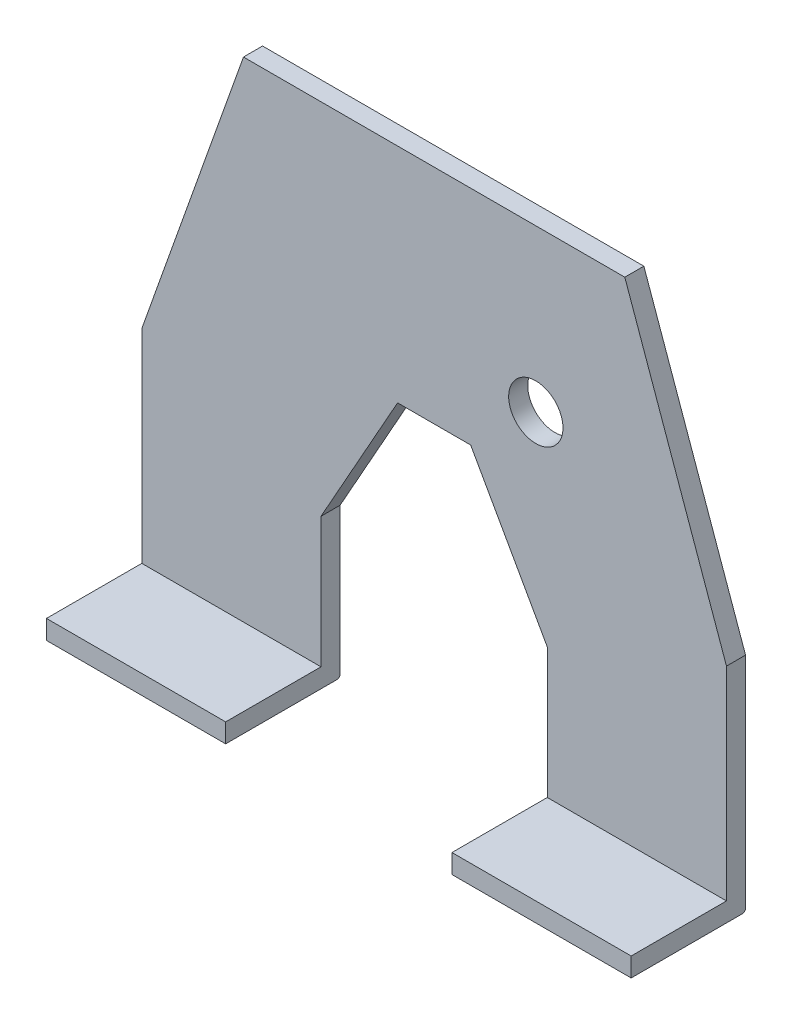
ISO-10303-21;
HEADER;
FILE_DESCRIPTION(('STEP AP214'),'2;1');
FILE_NAME('part.step','',(''),(''),'','','');
FILE_SCHEMA(('AUTOMOTIVE_DESIGN { 1 0 10303 214 1 1 1 1 }'));
ENDSEC;
DATA;
#1=APPLICATION_CONTEXT('core data for automotive mechanical design processes');
#2=APPLICATION_PROTOCOL_DEFINITION('international standard','automotive_design',2000,#1);
#3=PRODUCT_CONTEXT('',#1,'mechanical');
#4=PRODUCT('Part','Part','',(#3));
#5=PRODUCT_RELATED_PRODUCT_CATEGORY('part','',(#4));
#6=PRODUCT_DEFINITION_FORMATION('','',#4);
#7=PRODUCT_DEFINITION_CONTEXT('part definition',#1,'design');
#8=PRODUCT_DEFINITION('design','',#6,#7);
#9=PRODUCT_DEFINITION_SHAPE('','',#8);
#10=(LENGTH_UNIT() NAMED_UNIT(*) SI_UNIT(.MILLI.,.METRE.));
#11=(NAMED_UNIT(*) PLANE_ANGLE_UNIT() SI_UNIT($,.RADIAN.));
#12=(NAMED_UNIT(*) SI_UNIT($,.STERADIAN.) SOLID_ANGLE_UNIT());
#13=UNCERTAINTY_MEASURE_WITH_UNIT(LENGTH_MEASURE(1.E-05),#10,'distance_accuracy_value','');
#14=(GEOMETRIC_REPRESENTATION_CONTEXT(3) GLOBAL_UNCERTAINTY_ASSIGNED_CONTEXT((#13)) GLOBAL_UNIT_ASSIGNED_CONTEXT((#10,
#11,#12)) REPRESENTATION_CONTEXT('',''));
#15=CARTESIAN_POINT('',(0.,0.,0.));
#16=DIRECTION('',(0.,0.,1.));
#17=DIRECTION('',(1.,0.,0.));
#18=AXIS2_PLACEMENT_3D('',#15,#16,#17);
#19=CARTESIAN_POINT('',(0.,0.,3.));
#20=DIRECTION('',(0.,0.,-1.));
#21=DIRECTION('',(-1.,0.,0.));
#22=AXIS2_PLACEMENT_3D('',#19,#20,#21);
#23=PLANE('',#22);
#24=DIRECTION('',(0.,-1.,0.));
#25=VECTOR('',#24,1.);
#26=CARTESIAN_POINT('',(-46.,-40.,3.));
#27=LINE('',#26,#25);
#28=CARTESIAN_POINT('',(-46.,-5.,3.));
#29=VERTEX_POINT('',#28);
#30=CARTESIAN_POINT('',(-46.,-37.,3.));
#31=VERTEX_POINT('',#30);
#32=EDGE_CURVE('E230',#29,#31,#27,.T.);
#33=ORIENTED_EDGE('',*,*,#32,.T.);
#34=DIRECTION('',(1.,0.,0.));
#35=VECTOR('',#34,1.);
#36=CARTESIAN_POINT('',(0.,-37.,3.));
#37=LINE('',#36,#35);
#38=CARTESIAN_POINT('',(-17.8038412727349,-37.,3.));
#39=VERTEX_POINT('',#38);
#40=EDGE_CURVE('E191',#31,#39,#37,.T.);
#41=ORIENTED_EDGE('',*,*,#40,.T.);
#42=DIRECTION('',(0.,1.,0.));
#43=VECTOR('',#42,1.);
#44=CARTESIAN_POINT('',(-17.8038412727349,-16.4842842767622,3.));
#45=LINE('',#44,#43);
#46=CARTESIAN_POINT('',(-17.8038412727349,-16.4842842767622,3.));
#47=VERTEX_POINT('',#46);
#48=EDGE_CURVE('E232',#39,#47,#45,.T.);
#49=ORIENTED_EDGE('',*,*,#48,.T.);
#50=DIRECTION('',(0.489302901490051,0.872113909184699,0.));
#51=VECTOR('',#50,1.);
#52=CARTESIAN_POINT('',(-17.8038412727349,-16.4842842767622,3.));
#53=LINE('',#52,#51);
#54=CARTESIAN_POINT('',(-5.74999999999989,5.,3.));
#55=VERTEX_POINT('',#54);
#56=EDGE_CURVE('E234',#47,#55,#53,.T.);
#57=ORIENTED_EDGE('',*,*,#56,.T.);
#58=DIRECTION('',(1.,0.,0.));
#59=VECTOR('',#58,1.);
#60=CARTESIAN_POINT('',(-5.74999999999989,5.,3.));
#61=LINE('',#60,#59);
#62=CARTESIAN_POINT('',(5.74999999999989,5.,3.));
#63=VERTEX_POINT('',#62);
#64=EDGE_CURVE('E236',#55,#63,#61,.T.);
#65=ORIENTED_EDGE('',*,*,#64,.T.);
#66=DIRECTION('',(0.489302901490051,-0.872113909184699,0.));
#67=VECTOR('',#66,1.);
#68=CARTESIAN_POINT('',(17.8038412727349,-16.4842842767622,3.));
#69=LINE('',#68,#67);
#70=CARTESIAN_POINT('',(17.8038412727349,-16.4842842767622,3.));
#71=VERTEX_POINT('',#70);
#72=EDGE_CURVE('E238',#63,#71,#69,.T.);
#73=ORIENTED_EDGE('',*,*,#72,.T.);
#74=DIRECTION('',(0.,-1.,0.));
#75=VECTOR('',#74,1.);
#76=CARTESIAN_POINT('',(17.8038412727349,-16.4842842767622,3.));
#77=LINE('',#76,#75);
#78=CARTESIAN_POINT('',(17.8038412727349,-37.,3.));
#79=VERTEX_POINT('',#78);
#80=EDGE_CURVE('E240',#71,#79,#77,.T.);
#81=ORIENTED_EDGE('',*,*,#80,.T.);
#82=DIRECTION('',(1.,0.,0.));
#83=VECTOR('',#82,1.);
#84=CARTESIAN_POINT('',(0.,-37.,3.));
#85=LINE('',#84,#83);
#86=CARTESIAN_POINT('',(46.,-37.,3.));
#87=VERTEX_POINT('',#86);
#88=EDGE_CURVE('E211',#79,#87,#85,.T.);
#89=ORIENTED_EDGE('',*,*,#88,.T.);
#90=DIRECTION('',(0.,1.,0.));
#91=VECTOR('',#90,1.);
#92=CARTESIAN_POINT('',(46.,-40.,3.));
#93=LINE('',#92,#91);
#94=CARTESIAN_POINT('',(46.,-4.99999999999999,3.));
#95=VERTEX_POINT('',#94);
#96=EDGE_CURVE('E242',#87,#95,#93,.T.);
#97=ORIENTED_EDGE('',*,*,#96,.T.);
#98=DIRECTION('',(-0.335009667654806,0.942214690279141,0.));
#99=VECTOR('',#98,1.);
#100=CARTESIAN_POINT('',(46.,-4.99999999999999,3.));
#101=LINE('',#100,#99);
#102=CARTESIAN_POINT('',(30.,40.,3.));
#103=VERTEX_POINT('',#102);
#104=EDGE_CURVE('E222',#95,#103,#101,.T.);
#105=ORIENTED_EDGE('',*,*,#104,.T.);
#106=DIRECTION('',(-1.,0.,0.));
#107=VECTOR('',#106,1.);
#108=CARTESIAN_POINT('',(-30.,40.,3.));
#109=LINE('',#108,#107);
#110=CARTESIAN_POINT('',(-30.,40.,3.));
#111=VERTEX_POINT('',#110);
#112=EDGE_CURVE('E225',#103,#111,#109,.T.);
#113=ORIENTED_EDGE('',*,*,#112,.T.);
#114=DIRECTION('',(-0.335009667654806,-0.942214690279141,0.));
#115=VECTOR('',#114,1.);
#116=CARTESIAN_POINT('',(-46.,-5.,3.));
#117=LINE('',#116,#115);
#118=EDGE_CURVE('E228',#111,#29,#117,.T.);
#119=ORIENTED_EDGE('',*,*,#118,.T.);
#120=EDGE_LOOP('',(#33,#41,#49,#57,#65,#73,#81,#89,#97,#105,#113,#119));
#121=FACE_BOUND('',#120,.T.);
#122=CARTESIAN_POINT('',(16.,14.6,3.));
#123=DIRECTION('',(0.,0.,1.));
#124=DIRECTION('',(1.,0.,0.));
#125=AXIS2_PLACEMENT_3D('',#122,#123,#124);
#126=CIRCLE('',#125,4.27178047631967);
#127=CARTESIAN_POINT('',(20.2717804763197,14.6,3.));
#128=VERTEX_POINT('',#127);
#129=EDGE_CURVE('E216',#128,#128,#126,.T.);
#130=ORIENTED_EDGE('',*,*,#129,.F.);
#131=EDGE_LOOP('',(#130));
#132=FACE_BOUND('',#131,.T.);
#133=ADVANCED_FACE('F33',(#121,#132),#23,.F.);
#134=CARTESIAN_POINT('',(0.,0.,0.));
#135=DIRECTION('',(0.,0.,-1.));
#136=DIRECTION('',(-1.,0.,0.));
#137=AXIS2_PLACEMENT_3D('',#134,#135,#136);
#138=PLANE('',#137);
#139=DIRECTION('',(0.,1.,0.));
#140=VECTOR('',#139,1.);
#141=CARTESIAN_POINT('',(-17.8038412727349,-16.4842842767622,0.));
#142=LINE('',#141,#140);
#143=CARTESIAN_POINT('',(-17.8038412727349,-39.5,0.));
#144=VERTEX_POINT('',#143);
#145=CARTESIAN_POINT('',(-17.8038412727349,-16.4842842767622,0.));
#146=VERTEX_POINT('',#145);
#147=EDGE_CURVE('E254',#144,#146,#142,.T.);
#148=ORIENTED_EDGE('',*,*,#147,.F.);
#149=DIRECTION('',(1.,0.,0.));
#150=VECTOR('',#149,1.);
#151=CARTESIAN_POINT('',(-46.,-39.5,0.));
#152=LINE('',#151,#150);
#153=CARTESIAN_POINT('',(-46.,-39.5,0.));
#154=VERTEX_POINT('',#153);
#155=EDGE_CURVE('E298',#144,#154,#152,.F.);
#156=ORIENTED_EDGE('',*,*,#155,.T.);
#157=DIRECTION('',(0.,-1.,0.));
#158=VECTOR('',#157,1.);
#159=CARTESIAN_POINT('',(-46.,-40.,0.));
#160=LINE('',#159,#158);
#161=CARTESIAN_POINT('',(-46.,-5.,0.));
#162=VERTEX_POINT('',#161);
#163=EDGE_CURVE('E251',#162,#154,#160,.T.);
#164=ORIENTED_EDGE('',*,*,#163,.F.);
#165=DIRECTION('',(-0.335009667654806,-0.942214690279141,0.));
#166=VECTOR('',#165,1.);
#167=CARTESIAN_POINT('',(-46.,-5.,0.));
#168=LINE('',#167,#166);
#169=CARTESIAN_POINT('',(-30.,40.,0.));
#170=VERTEX_POINT('',#169);
#171=EDGE_CURVE('E249',#170,#162,#168,.T.);
#172=ORIENTED_EDGE('',*,*,#171,.F.);
#173=DIRECTION('',(-1.,0.,0.));
#174=VECTOR('',#173,1.);
#175=CARTESIAN_POINT('',(-30.,40.,0.));
#176=LINE('',#175,#174);
#177=CARTESIAN_POINT('',(30.,40.,0.));
#178=VERTEX_POINT('',#177);
#179=EDGE_CURVE('E247',#178,#170,#176,.T.);
#180=ORIENTED_EDGE('',*,*,#179,.F.);
#181=DIRECTION('',(-0.335009667654806,0.942214690279141,0.));
#182=VECTOR('',#181,1.);
#183=CARTESIAN_POINT('',(46.,-4.99999999999999,0.));
#184=LINE('',#183,#182);
#185=CARTESIAN_POINT('',(46.,-4.99999999999999,0.));
#186=VERTEX_POINT('',#185);
#187=EDGE_CURVE('E219',#186,#178,#184,.T.);
#188=ORIENTED_EDGE('',*,*,#187,.F.);
#189=DIRECTION('',(0.,1.,0.));
#190=VECTOR('',#189,1.);
#191=CARTESIAN_POINT('',(46.,-40.,0.));
#192=LINE('',#191,#190);
#193=CARTESIAN_POINT('',(46.,-39.5,0.));
#194=VERTEX_POINT('',#193);
#195=EDGE_CURVE('E226',#194,#186,#192,.T.);
#196=ORIENTED_EDGE('',*,*,#195,.F.);
#197=DIRECTION('',(1.,0.,0.));
#198=VECTOR('',#197,1.);
#199=CARTESIAN_POINT('',(17.8038412727349,-39.5,0.));
#200=LINE('',#199,#198);
#201=CARTESIAN_POINT('',(17.8038412727349,-39.5,0.));
#202=VERTEX_POINT('',#201);
#203=EDGE_CURVE('E296',#194,#202,#200,.F.);
#204=ORIENTED_EDGE('',*,*,#203,.T.);
#205=DIRECTION('',(0.,-1.,0.));
#206=VECTOR('',#205,1.);
#207=CARTESIAN_POINT('',(17.8038412727349,-16.4842842767622,0.));
#208=LINE('',#207,#206);
#209=CARTESIAN_POINT('',(17.8038412727349,-16.4842842767622,0.));
#210=VERTEX_POINT('',#209);
#211=EDGE_CURVE('E262',#210,#202,#208,.T.);
#212=ORIENTED_EDGE('',*,*,#211,.F.);
#213=DIRECTION('',(0.489302901490051,-0.872113909184699,0.));
#214=VECTOR('',#213,1.);
#215=CARTESIAN_POINT('',(17.8038412727349,-16.4842842767622,0.));
#216=LINE('',#215,#214);
#217=CARTESIAN_POINT('',(5.74999999999989,5.,0.));
#218=VERTEX_POINT('',#217);
#219=EDGE_CURVE('E260',#218,#210,#216,.T.);
#220=ORIENTED_EDGE('',*,*,#219,.F.);
#221=DIRECTION('',(1.,0.,0.));
#222=VECTOR('',#221,1.);
#223=CARTESIAN_POINT('',(-5.74999999999989,5.,0.));
#224=LINE('',#223,#222);
#225=CARTESIAN_POINT('',(-5.74999999999989,5.,0.));
#226=VERTEX_POINT('',#225);
#227=EDGE_CURVE('E258',#226,#218,#224,.T.);
#228=ORIENTED_EDGE('',*,*,#227,.F.);
#229=DIRECTION('',(0.489302901490051,0.872113909184699,0.));
#230=VECTOR('',#229,1.);
#231=CARTESIAN_POINT('',(-17.8038412727349,-16.4842842767622,0.));
#232=LINE('',#231,#230);
#233=EDGE_CURVE('E256',#146,#226,#232,.T.);
#234=ORIENTED_EDGE('',*,*,#233,.F.);
#235=EDGE_LOOP('',(#148,#156,#164,#172,#180,#188,#196,#204,#212,#220,#228,#234));
#236=FACE_BOUND('',#235,.T.);
#237=CARTESIAN_POINT('',(16.,14.6,0.));
#238=DIRECTION('',(0.,0.,1.));
#239=DIRECTION('',(1.,0.,0.));
#240=AXIS2_PLACEMENT_3D('',#237,#238,#239);
#241=CIRCLE('',#240,4.27178047631967);
#242=CARTESIAN_POINT('',(20.2717804763197,14.6,0.));
#243=VERTEX_POINT('',#242);
#244=EDGE_CURVE('E215',#243,#243,#241,.T.);
#245=ORIENTED_EDGE('',*,*,#244,.T.);
#246=EDGE_LOOP('',(#245));
#247=FACE_BOUND('',#246,.T.);
#248=ADVANCED_FACE('F310',(#236,#247),#138,.T.);
#249=CARTESIAN_POINT('',(46.,-4.99999999999999,3.));
#250=DIRECTION('',(-0.94221469027914,-0.335009667654806,0.));
#251=DIRECTION('',(0.335009667654806,-0.942214690279141,0.));
#252=AXIS2_PLACEMENT_3D('',#249,#250,#251);
#253=PLANE('',#252);
#254=ORIENTED_EDGE('',*,*,#187,.T.);
#255=DIRECTION('',(0.,0.,-1.));
#256=VECTOR('',#255,1.);
#257=CARTESIAN_POINT('',(30.,40.,3.));
#258=LINE('',#257,#256);
#259=EDGE_CURVE('E290',#103,#178,#258,.T.);
#260=ORIENTED_EDGE('',*,*,#259,.F.);
#261=ORIENTED_EDGE('',*,*,#104,.F.);
#262=DIRECTION('',(0.,0.,-1.));
#263=VECTOR('',#262,1.);
#264=CARTESIAN_POINT('',(46.,-4.99999999999999,3.));
#265=LINE('',#264,#263);
#266=EDGE_CURVE('E244',#95,#186,#265,.T.);
#267=ORIENTED_EDGE('',*,*,#266,.T.);
#268=EDGE_LOOP('',(#254,#260,#261,#267));
#269=FACE_BOUND('',#268,.T.);
#270=ADVANCED_FACE('F364',(#269),#253,.F.);
#271=CARTESIAN_POINT('',(-30.,40.,3.));
#272=DIRECTION('',(0.,-1.,0.));
#273=DIRECTION('',(1.,0.,0.));
#274=AXIS2_PLACEMENT_3D('',#271,#272,#273);
#275=PLANE('',#274);
#276=ORIENTED_EDGE('',*,*,#179,.T.);
#277=DIRECTION('',(0.,0.,-1.));
#278=VECTOR('',#277,1.);
#279=CARTESIAN_POINT('',(-30.,40.,3.));
#280=LINE('',#279,#278);
#281=EDGE_CURVE('E287',#111,#170,#280,.T.);
#282=ORIENTED_EDGE('',*,*,#281,.F.);
#283=ORIENTED_EDGE('',*,*,#112,.F.);
#284=ORIENTED_EDGE('',*,*,#259,.T.);
#285=EDGE_LOOP('',(#276,#282,#283,#284));
#286=FACE_BOUND('',#285,.T.);
#287=ADVANCED_FACE('F360',(#286),#275,.F.);
#288=CARTESIAN_POINT('',(-46.,-5.,3.));
#289=DIRECTION('',(0.94221469027914,-0.335009667654805,0.));
#290=DIRECTION('',(0.335009667654805,0.942214690279141,0.));
#291=AXIS2_PLACEMENT_3D('',#288,#289,#290);
#292=PLANE('',#291);
#293=ORIENTED_EDGE('',*,*,#171,.T.);
#294=DIRECTION('',(0.,0.,-1.));
#295=VECTOR('',#294,1.);
#296=CARTESIAN_POINT('',(-46.,-5.,3.));
#297=LINE('',#296,#295);
#298=EDGE_CURVE('E284',#29,#162,#297,.T.);
#299=ORIENTED_EDGE('',*,*,#298,.F.);
#300=ORIENTED_EDGE('',*,*,#118,.F.);
#301=ORIENTED_EDGE('',*,*,#281,.T.);
#302=EDGE_LOOP('',(#293,#299,#300,#301));
#303=FACE_BOUND('',#302,.T.);
#304=ADVANCED_FACE('F356',(#303),#292,.F.);
#305=CARTESIAN_POINT('',(-46.,-40.,3.));
#306=DIRECTION('',(1.,0.,0.));
#307=DIRECTION('',(0.,0.,-1.));
#308=AXIS2_PLACEMENT_3D('',#305,#306,#307);
#309=PLANE('',#308);
#310=ORIENTED_EDGE('',*,*,#163,.T.);
#311=CARTESIAN_POINT('',(-46.,-39.5,0.5));
#312=DIRECTION('',(1.,0.,0.));
#313=DIRECTION('',(0.,0.,-1.));
#314=AXIS2_PLACEMENT_3D('',#311,#312,#313);
#315=CIRCLE('',#314,0.5);
#316=CARTESIAN_POINT('',(-46.,-40.,0.5));
#317=VERTEX_POINT('',#316);
#318=EDGE_CURVE('E300',#154,#317,#315,.F.);
#319=ORIENTED_EDGE('',*,*,#318,.T.);
#320=DIRECTION('',(0.,0.,-1.));
#321=VECTOR('',#320,1.);
#322=CARTESIAN_POINT('',(-46.,-40.,3.));
#323=LINE('',#322,#321);
#324=CARTESIAN_POINT('',(-46.,-40.,18.));
#325=VERTEX_POINT('',#324);
#326=EDGE_CURVE('E167',#325,#317,#323,.T.);
#327=ORIENTED_EDGE('',*,*,#326,.F.);
#328=DIRECTION('',(0.,1.,0.));
#329=VECTOR('',#328,1.);
#330=CARTESIAN_POINT('',(-46.,-40.,18.));
#331=LINE('',#330,#329);
#332=CARTESIAN_POINT('',(-46.,-37.,18.));
#333=VERTEX_POINT('',#332);
#334=EDGE_CURVE('E178',#325,#333,#331,.T.);
#335=ORIENTED_EDGE('',*,*,#334,.T.);
#336=DIRECTION('',(0.,0.,-1.));
#337=VECTOR('',#336,1.);
#338=CARTESIAN_POINT('',(-46.,-37.,18.));
#339=LINE('',#338,#337);
#340=EDGE_CURVE('E189',#333,#31,#339,.T.);
#341=ORIENTED_EDGE('',*,*,#340,.T.);
#342=ORIENTED_EDGE('',*,*,#32,.F.);
#343=ORIENTED_EDGE('',*,*,#298,.T.);
#344=EDGE_LOOP('',(#310,#319,#327,#335,#341,#342,#343));
#345=FACE_BOUND('',#344,.T.);
#346=ADVANCED_FACE('F351',(#345),#309,.F.);
#347=CARTESIAN_POINT('',(-46.,-40.,3.));
#348=DIRECTION('',(0.,1.,0.));
#349=DIRECTION('',(0.,0.,1.));
#350=AXIS2_PLACEMENT_3D('',#347,#348,#349);
#351=PLANE('',#350);
#352=ORIENTED_EDGE('',*,*,#326,.T.);
#353=DIRECTION('',(1.,0.,0.));
#354=VECTOR('',#353,1.);
#355=CARTESIAN_POINT('',(-17.8038412727349,-40.,0.5));
#356=LINE('',#355,#354);
#357=CARTESIAN_POINT('',(-17.8038412727349,-40.,0.5));
#358=VERTEX_POINT('',#357);
#359=EDGE_CURVE('E164',#317,#358,#356,.T.);
#360=ORIENTED_EDGE('',*,*,#359,.T.);
#361=DIRECTION('',(0.,0.,-1.));
#362=VECTOR('',#361,1.);
#363=CARTESIAN_POINT('',(-17.8038412727349,-40.,3.));
#364=LINE('',#363,#362);
#365=CARTESIAN_POINT('',(-17.8038412727349,-40.,18.));
#366=VERTEX_POINT('',#365);
#367=EDGE_CURVE('E158',#366,#358,#364,.T.);
#368=ORIENTED_EDGE('',*,*,#367,.F.);
#369=DIRECTION('',(-1.,0.,0.));
#370=VECTOR('',#369,1.);
#371=CARTESIAN_POINT('',(-17.8038412727349,-40.,18.));
#372=LINE('',#371,#370);
#373=EDGE_CURVE('E162',#366,#325,#372,.T.);
#374=ORIENTED_EDGE('',*,*,#373,.T.);
#375=EDGE_LOOP('',(#352,#360,#368,#374));
#376=FACE_BOUND('',#375,.T.);
#377=ADVANCED_FACE('F161',(#376),#351,.F.);
#378=CARTESIAN_POINT('',(-17.8038412727349,-16.4842842767622,3.));
#379=DIRECTION('',(-1.,0.,0.));
#380=DIRECTION('',(0.,0.,1.));
#381=AXIS2_PLACEMENT_3D('',#378,#379,#380);
#382=PLANE('',#381);
#383=ORIENTED_EDGE('',*,*,#367,.T.);
#384=CARTESIAN_POINT('',(-17.8038412727349,-39.5,0.5));
#385=DIRECTION('',(-1.,0.,0.));
#386=DIRECTION('',(0.,0.,1.));
#387=AXIS2_PLACEMENT_3D('',#384,#385,#386);
#388=CIRCLE('',#387,0.5);
#389=EDGE_CURVE('E294',#358,#144,#388,.F.);
#390=ORIENTED_EDGE('',*,*,#389,.T.);
#391=ORIENTED_EDGE('',*,*,#147,.T.);
#392=DIRECTION('',(0.,0.,-1.));
#393=VECTOR('',#392,1.);
#394=CARTESIAN_POINT('',(-17.8038412727349,-16.4842842767622,3.));
#395=LINE('',#394,#393);
#396=EDGE_CURVE('E168',#47,#146,#395,.T.);
#397=ORIENTED_EDGE('',*,*,#396,.F.);
#398=ORIENTED_EDGE('',*,*,#48,.F.);
#399=DIRECTION('',(0.,0.,-1.));
#400=VECTOR('',#399,1.);
#401=CARTESIAN_POINT('',(-17.8038412727349,-37.,18.));
#402=LINE('',#401,#400);
#403=CARTESIAN_POINT('',(-17.8038412727349,-37.,18.));
#404=VERTEX_POINT('',#403);
#405=EDGE_CURVE('E183',#404,#39,#402,.T.);
#406=ORIENTED_EDGE('',*,*,#405,.F.);
#407=DIRECTION('',(0.,-1.,0.));
#408=VECTOR('',#407,1.);
#409=CARTESIAN_POINT('',(-17.8038412727349,-40.,18.));
#410=LINE('',#409,#408);
#411=EDGE_CURVE('E175',#404,#366,#410,.T.);
#412=ORIENTED_EDGE('',*,*,#411,.T.);
#413=EDGE_LOOP('',(#383,#390,#391,#397,#398,#406,#412));
#414=FACE_BOUND('',#413,.T.);
#415=ADVANCED_FACE('F180',(#414),#382,.F.);
#416=CARTESIAN_POINT('',(-17.8038412727349,-16.4842842767622,3.));
#417=DIRECTION('',(-0.872113909184699,0.48930290149005,0.));
#418=DIRECTION('',(-0.489302901490051,-0.872113909184699,0.));
#419=AXIS2_PLACEMENT_3D('',#416,#417,#418);
#420=PLANE('',#419);
#421=ORIENTED_EDGE('',*,*,#233,.T.);
#422=DIRECTION('',(0.,0.,-1.));
#423=VECTOR('',#422,1.);
#424=CARTESIAN_POINT('',(-5.74999999999989,5.,3.));
#425=LINE('',#424,#423);
#426=EDGE_CURVE('E278',#55,#226,#425,.T.);
#427=ORIENTED_EDGE('',*,*,#426,.F.);
#428=ORIENTED_EDGE('',*,*,#56,.F.);
#429=ORIENTED_EDGE('',*,*,#396,.T.);
#430=EDGE_LOOP('',(#421,#427,#428,#429));
#431=FACE_BOUND('',#430,.T.);
#432=ADVANCED_FACE('F343',(#431),#420,.F.);
#433=CARTESIAN_POINT('',(-5.74999999999989,5.,3.));
#434=DIRECTION('',(0.,1.,0.));
#435=DIRECTION('',(-1.,0.,0.));
#436=AXIS2_PLACEMENT_3D('',#433,#434,#435);
#437=PLANE('',#436);
#438=ORIENTED_EDGE('',*,*,#227,.T.);
#439=DIRECTION('',(0.,0.,-1.));
#440=VECTOR('',#439,1.);
#441=CARTESIAN_POINT('',(5.74999999999989,5.,3.));
#442=LINE('',#441,#440);
#443=EDGE_CURVE('E275',#63,#218,#442,.T.);
#444=ORIENTED_EDGE('',*,*,#443,.F.);
#445=ORIENTED_EDGE('',*,*,#64,.F.);
#446=ORIENTED_EDGE('',*,*,#426,.T.);
#447=EDGE_LOOP('',(#438,#444,#445,#446));
#448=FACE_BOUND('',#447,.T.);
#449=ADVANCED_FACE('F339',(#448),#437,.F.);
#450=CARTESIAN_POINT('',(17.8038412727349,-16.4842842767622,3.));
#451=DIRECTION('',(0.872113909184699,0.489302901490051,0.));
#452=DIRECTION('',(-0.489302901490051,0.872113909184699,0.));
#453=AXIS2_PLACEMENT_3D('',#450,#451,#452);
#454=PLANE('',#453);
#455=ORIENTED_EDGE('',*,*,#219,.T.);
#456=DIRECTION('',(0.,0.,-1.));
#457=VECTOR('',#456,1.);
#458=CARTESIAN_POINT('',(17.8038412727349,-16.4842842767622,3.));
#459=LINE('',#458,#457);
#460=EDGE_CURVE('E272',#71,#210,#459,.T.);
#461=ORIENTED_EDGE('',*,*,#460,.F.);
#462=ORIENTED_EDGE('',*,*,#72,.F.);
#463=ORIENTED_EDGE('',*,*,#443,.T.);
#464=EDGE_LOOP('',(#455,#461,#462,#463));
#465=FACE_BOUND('',#464,.T.);
#466=ADVANCED_FACE('F334',(#465),#454,.F.);
#467=CARTESIAN_POINT('',(17.8038412727349,-16.4842842767622,3.));
#468=DIRECTION('',(1.,0.,0.));
#469=DIRECTION('',(0.,0.,-1.));
#470=AXIS2_PLACEMENT_3D('',#467,#468,#469);
#471=PLANE('',#470);
#472=ORIENTED_EDGE('',*,*,#211,.T.);
#473=CARTESIAN_POINT('',(17.8038412727349,-39.5,0.5));
#474=DIRECTION('',(1.,0.,0.));
#475=DIRECTION('',(0.,0.,-1.));
#476=AXIS2_PLACEMENT_3D('',#473,#474,#475);
#477=CIRCLE('',#476,0.5);
#478=CARTESIAN_POINT('',(17.8038412727349,-40.,0.5));
#479=VERTEX_POINT('',#478);
#480=EDGE_CURVE('E11',#202,#479,#477,.F.);
#481=ORIENTED_EDGE('',*,*,#480,.T.);
#482=DIRECTION('',(0.,0.,-1.));
#483=VECTOR('',#482,1.);
#484=CARTESIAN_POINT('',(17.8038412727349,-40.,3.));
#485=LINE('',#484,#483);
#486=CARTESIAN_POINT('',(17.8038412727349,-40.,18.));
#487=VERTEX_POINT('',#486);
#488=EDGE_CURVE('E270',#487,#479,#485,.T.);
#489=ORIENTED_EDGE('',*,*,#488,.F.);
#490=DIRECTION('',(0.,1.,0.));
#491=VECTOR('',#490,1.);
#492=CARTESIAN_POINT('',(17.8038412727349,-40.,18.));
#493=LINE('',#492,#491);
#494=CARTESIAN_POINT('',(17.8038412727349,-37.,18.));
#495=VERTEX_POINT('',#494);
#496=EDGE_CURVE('E201',#487,#495,#493,.T.);
#497=ORIENTED_EDGE('',*,*,#496,.T.);
#498=DIRECTION('',(0.,0.,-1.));
#499=VECTOR('',#498,1.);
#500=CARTESIAN_POINT('',(17.8038412727349,-37.,18.));
#501=LINE('',#500,#499);
#502=EDGE_CURVE('E207',#495,#79,#501,.T.);
#503=ORIENTED_EDGE('',*,*,#502,.T.);
#504=ORIENTED_EDGE('',*,*,#80,.F.);
#505=ORIENTED_EDGE('',*,*,#460,.T.);
#506=EDGE_LOOP('',(#472,#481,#489,#497,#503,#504,#505));
#507=FACE_BOUND('',#506,.T.);
#508=ADVANCED_FACE('F317',(#507),#471,.F.);
#509=CARTESIAN_POINT('',(17.8038412727349,-40.,3.));
#510=DIRECTION('',(0.,1.,0.));
#511=DIRECTION('',(-1.,0.,0.));
#512=AXIS2_PLACEMENT_3D('',#509,#510,#511);
#513=PLANE('',#512);
#514=ORIENTED_EDGE('',*,*,#488,.T.);
#515=DIRECTION('',(1.,0.,0.));
#516=VECTOR('',#515,1.);
#517=CARTESIAN_POINT('',(46.,-40.,0.5));
#518=LINE('',#517,#516);
#519=CARTESIAN_POINT('',(46.,-40.,0.5));
#520=VERTEX_POINT('',#519);
#521=EDGE_CURVE('E302',#479,#520,#518,.T.);
#522=ORIENTED_EDGE('',*,*,#521,.T.);
#523=DIRECTION('',(0.,0.,-1.));
#524=VECTOR('',#523,1.);
#525=CARTESIAN_POINT('',(46.,-40.,3.));
#526=LINE('',#525,#524);
#527=CARTESIAN_POINT('',(46.,-40.,18.));
#528=VERTEX_POINT('',#527);
#529=EDGE_CURVE('E267',#528,#520,#526,.T.);
#530=ORIENTED_EDGE('',*,*,#529,.F.);
#531=DIRECTION('',(-1.,0.,0.));
#532=VECTOR('',#531,1.);
#533=CARTESIAN_POINT('',(46.,-40.,18.));
#534=LINE('',#533,#532);
#535=EDGE_CURVE('E198',#528,#487,#534,.T.);
#536=ORIENTED_EDGE('',*,*,#535,.T.);
#537=EDGE_LOOP('',(#514,#522,#530,#536));
#538=FACE_BOUND('',#537,.T.);
#539=ADVANCED_FACE('F314',(#538),#513,.F.);
#540=CARTESIAN_POINT('',(46.,-40.,3.));
#541=DIRECTION('',(-1.,0.,0.));
#542=DIRECTION('',(0.,0.,1.));
#543=AXIS2_PLACEMENT_3D('',#540,#541,#542);
#544=PLANE('',#543);
#545=ORIENTED_EDGE('',*,*,#529,.T.);
#546=CARTESIAN_POINT('',(46.,-39.5,0.5));
#547=DIRECTION('',(-1.,0.,0.));
#548=DIRECTION('',(0.,0.,1.));
#549=AXIS2_PLACEMENT_3D('',#546,#547,#548);
#550=CIRCLE('',#549,0.5);
#551=EDGE_CURVE('E41',#520,#194,#550,.F.);
#552=ORIENTED_EDGE('',*,*,#551,.T.);
#553=ORIENTED_EDGE('',*,*,#195,.T.);
#554=ORIENTED_EDGE('',*,*,#266,.F.);
#555=ORIENTED_EDGE('',*,*,#96,.F.);
#556=DIRECTION('',(0.,0.,-1.));
#557=VECTOR('',#556,1.);
#558=CARTESIAN_POINT('',(46.,-37.,18.));
#559=LINE('',#558,#557);
#560=CARTESIAN_POINT('',(46.,-37.,18.));
#561=VERTEX_POINT('',#560);
#562=EDGE_CURVE('E208',#561,#87,#559,.T.);
#563=ORIENTED_EDGE('',*,*,#562,.F.);
#564=DIRECTION('',(0.,-1.,0.));
#565=VECTOR('',#564,1.);
#566=CARTESIAN_POINT('',(46.,-40.,18.));
#567=LINE('',#566,#565);
#568=EDGE_CURVE('E195',#561,#528,#567,.T.);
#569=ORIENTED_EDGE('',*,*,#568,.T.);
#570=EDGE_LOOP('',(#545,#552,#553,#554,#555,#563,#569));
#571=FACE_BOUND('',#570,.T.);
#572=ADVANCED_FACE('F305',(#571),#544,.F.);
#573=CARTESIAN_POINT('',(16.,14.6,3.));
#574=DIRECTION('',(0.,0.,-1.));
#575=DIRECTION('',(-1.,0.,0.));
#576=AXIS2_PLACEMENT_3D('',#573,#574,#575);
#577=CYLINDRICAL_SURFACE('',#576,4.27178047631967);
#578=ORIENTED_EDGE('',*,*,#129,.T.);
#579=EDGE_LOOP('',(#578));
#580=FACE_BOUND('',#579,.T.);
#581=ORIENTED_EDGE('',*,*,#244,.F.);
#582=EDGE_LOOP('',(#581));
#583=FACE_BOUND('',#582,.T.);
#584=ADVANCED_FACE('F384',(#580,#583),#577,.F.);
#585=CARTESIAN_POINT('',(46.,-37.,18.));
#586=DIRECTION('',(0.,1.,0.));
#587=DIRECTION('',(0.,0.,1.));
#588=AXIS2_PLACEMENT_3D('',#585,#586,#587);
#589=PLANE('',#588);
#590=ORIENTED_EDGE('',*,*,#88,.F.);
#591=ORIENTED_EDGE('',*,*,#502,.F.);
#592=DIRECTION('',(1.,0.,0.));
#593=VECTOR('',#592,1.);
#594=CARTESIAN_POINT('',(46.,-37.,18.));
#595=LINE('',#594,#593);
#596=EDGE_CURVE('E204',#495,#561,#595,.T.);
#597=ORIENTED_EDGE('',*,*,#596,.T.);
#598=ORIENTED_EDGE('',*,*,#562,.T.);
#599=EDGE_LOOP('',(#590,#591,#597,#598));
#600=FACE_BOUND('',#599,.T.);
#601=ADVANCED_FACE('F324',(#600),#589,.T.);
#602=CARTESIAN_POINT('',(0.,0.,18.));
#603=DIRECTION('',(0.,0.,1.));
#604=DIRECTION('',(1.,0.,0.));
#605=AXIS2_PLACEMENT_3D('',#602,#603,#604);
#606=PLANE('',#605);
#607=ORIENTED_EDGE('',*,*,#568,.F.);
#608=ORIENTED_EDGE('',*,*,#596,.F.);
#609=ORIENTED_EDGE('',*,*,#496,.F.);
#610=ORIENTED_EDGE('',*,*,#535,.F.);
#611=EDGE_LOOP('',(#607,#608,#609,#610));
#612=FACE_BOUND('',#611,.T.);
#613=ADVANCED_FACE('F321',(#612),#606,.T.);
#614=CARTESIAN_POINT('',(-17.8038412727349,-37.,18.));
#615=DIRECTION('',(0.,1.,0.));
#616=DIRECTION('',(0.,0.,1.));
#617=AXIS2_PLACEMENT_3D('',#614,#615,#616);
#618=PLANE('',#617);
#619=ORIENTED_EDGE('',*,*,#40,.F.);
#620=ORIENTED_EDGE('',*,*,#340,.F.);
#621=DIRECTION('',(1.,0.,0.));
#622=VECTOR('',#621,1.);
#623=CARTESIAN_POINT('',(-17.8038412727349,-37.,18.));
#624=LINE('',#623,#622);
#625=EDGE_CURVE('E187',#333,#404,#624,.T.);
#626=ORIENTED_EDGE('',*,*,#625,.T.);
#627=ORIENTED_EDGE('',*,*,#405,.T.);
#628=EDGE_LOOP('',(#619,#620,#626,#627));
#629=FACE_BOUND('',#628,.T.);
#630=ADVANCED_FACE('F367',(#629),#618,.T.);
#631=CARTESIAN_POINT('',(0.,0.,18.));
#632=DIRECTION('',(0.,0.,1.));
#633=DIRECTION('',(1.,0.,0.));
#634=AXIS2_PLACEMENT_3D('',#631,#632,#633);
#635=PLANE('',#634);
#636=ORIENTED_EDGE('',*,*,#411,.F.);
#637=ORIENTED_EDGE('',*,*,#625,.F.);
#638=ORIENTED_EDGE('',*,*,#334,.F.);
#639=ORIENTED_EDGE('',*,*,#373,.F.);
#640=EDGE_LOOP('',(#636,#637,#638,#639));
#641=FACE_BOUND('',#640,.T.);
#642=ADVANCED_FACE('F173',(#641),#635,.T.);
#643=CARTESIAN_POINT('',(-46.,-39.5,0.5));
#644=DIRECTION('',(-1.,0.,0.));
#645=DIRECTION('',(0.,0.,1.));
#646=AXIS2_PLACEMENT_3D('',#643,#644,#645);
#647=CYLINDRICAL_SURFACE('',#646,0.5);
#648=ORIENTED_EDGE('',*,*,#318,.F.);
#649=ORIENTED_EDGE('',*,*,#155,.F.);
#650=ORIENTED_EDGE('',*,*,#389,.F.);
#651=ORIENTED_EDGE('',*,*,#359,.F.);
#652=EDGE_LOOP('',(#648,#649,#650,#651));
#653=FACE_BOUND('',#652,.T.);
#654=ADVANCED_FACE('F349',(#653),#647,.T.);
#655=CARTESIAN_POINT('',(17.8038412727349,-39.5,0.5));
#656=DIRECTION('',(-1.,0.,0.));
#657=DIRECTION('',(0.,-1.,0.));
#658=AXIS2_PLACEMENT_3D('',#655,#656,#657);
#659=CYLINDRICAL_SURFACE('',#658,0.5);
#660=ORIENTED_EDGE('',*,*,#480,.F.);
#661=ORIENTED_EDGE('',*,*,#203,.F.);
#662=ORIENTED_EDGE('',*,*,#551,.F.);
#663=ORIENTED_EDGE('',*,*,#521,.F.);
#664=EDGE_LOOP('',(#660,#661,#662,#663));
#665=FACE_BOUND('',#664,.T.);
#666=ADVANCED_FACE('F35',(#665),#659,.T.);
#667=CLOSED_SHELL('',(#133,#248,#270,#287,#304,#346,#377,#415,#432,#449,#466,#508,#539,#572,
#584,#601,#613,#630,#642,#654,#666));
#668=MANIFOLD_SOLID_BREP('B2',#667);
#669=ADVANCED_BREP_SHAPE_REPRESENTATION('',(#18,#668),#14);
#670=SHAPE_DEFINITION_REPRESENTATION(#9,#669);
ENDSEC;
END-ISO-10303-21;
